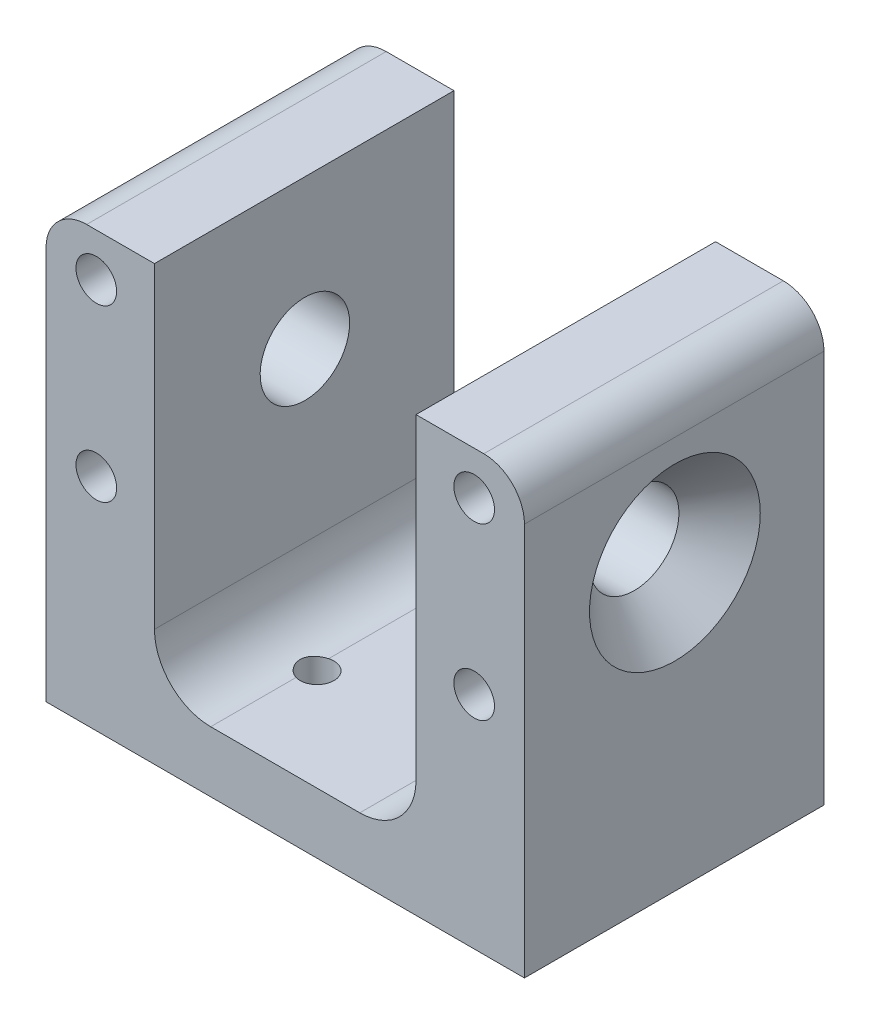
ISO-10303-21;
HEADER;
FILE_DESCRIPTION(('STEP AP214'),'2;1');
FILE_NAME('part.step','',(''),(''),'','','');
FILE_SCHEMA(('AUTOMOTIVE_DESIGN { 1 0 10303 214 1 1 1 1 }'));
ENDSEC;
DATA;
#1=APPLICATION_CONTEXT('core data for automotive mechanical design processes');
#2=APPLICATION_PROTOCOL_DEFINITION('international standard','automotive_design',2000,#1);
#3=PRODUCT_CONTEXT('',#1,'mechanical');
#4=PRODUCT('Part','Part','',(#3));
#5=PRODUCT_RELATED_PRODUCT_CATEGORY('part','',(#4));
#6=PRODUCT_DEFINITION_FORMATION('','',#4);
#7=PRODUCT_DEFINITION_CONTEXT('part definition',#1,'design');
#8=PRODUCT_DEFINITION('design','',#6,#7);
#9=PRODUCT_DEFINITION_SHAPE('','',#8);
#10=(LENGTH_UNIT() NAMED_UNIT(*) SI_UNIT(.MILLI.,.METRE.));
#11=(NAMED_UNIT(*) PLANE_ANGLE_UNIT() SI_UNIT($,.RADIAN.));
#12=(NAMED_UNIT(*) SI_UNIT($,.STERADIAN.) SOLID_ANGLE_UNIT());
#13=UNCERTAINTY_MEASURE_WITH_UNIT(LENGTH_MEASURE(1.E-05),#10,'distance_accuracy_value','');
#14=(GEOMETRIC_REPRESENTATION_CONTEXT(3) GLOBAL_UNCERTAINTY_ASSIGNED_CONTEXT((#13)) GLOBAL_UNIT_ASSIGNED_CONTEXT((#10,
#11,#12)) REPRESENTATION_CONTEXT('',''));
#15=CARTESIAN_POINT('',(0.,0.,0.));
#16=DIRECTION('',(0.,0.,1.));
#17=DIRECTION('',(1.,0.,0.));
#18=AXIS2_PLACEMENT_3D('',#15,#16,#17);
#19=CARTESIAN_POINT('',(27.3,32.,-32.));
#20=DIRECTION('',(1.,0.,0.));
#21=DIRECTION('',(0.,0.,-1.));
#22=AXIS2_PLACEMENT_3D('',#19,#20,#21);
#23=PLANE('',#22);
#24=CARTESIAN_POINT('',(27.3,21.,-11.1));
#25=DIRECTION('',(1.,0.,0.));
#26=DIRECTION('',(0.,0.,-1.));
#27=AXIS2_PLACEMENT_3D('',#24,#25,#26);
#28=CIRCLE('',#27,3.29999999999999);
#29=CARTESIAN_POINT('',(27.3,21.,-14.4));
#30=VERTEX_POINT('',#29);
#31=EDGE_CURVE('E238',#30,#30,#28,.T.);
#32=ORIENTED_EDGE('',*,*,#31,.T.);
#33=EDGE_LOOP('',(#32));
#34=FACE_BOUND('',#33,.T.);
#35=DIRECTION('',(0.,0.,1.));
#36=VECTOR('',#35,1.);
#37=CARTESIAN_POINT('',(27.3,8.63,-22.1));
#38=LINE('',#37,#36);
#39=CARTESIAN_POINT('',(27.3,8.63,-22.1));
#40=VERTEX_POINT('',#39);
#41=CARTESIAN_POINT('',(27.3,8.63,0.));
#42=VERTEX_POINT('',#41);
#43=EDGE_CURVE('E359',#40,#42,#38,.T.);
#44=ORIENTED_EDGE('',*,*,#43,.T.);
#45=DIRECTION('',(0.,1.,0.));
#46=VECTOR('',#45,1.);
#47=CARTESIAN_POINT('',(27.3,32.,0.));
#48=LINE('',#47,#46);
#49=CARTESIAN_POINT('',(27.3,32.,0.));
#50=VERTEX_POINT('',#49);
#51=EDGE_CURVE('E177',#42,#50,#48,.T.);
#52=ORIENTED_EDGE('',*,*,#51,.T.);
#53=DIRECTION('',(0.,0.,1.));
#54=VECTOR('',#53,1.);
#55=CARTESIAN_POINT('',(27.3,32.,0.));
#56=LINE('',#55,#54);
#57=CARTESIAN_POINT('',(27.3,32.,-22.1));
#58=VERTEX_POINT('',#57);
#59=EDGE_CURVE('E211',#58,#50,#56,.T.);
#60=ORIENTED_EDGE('',*,*,#59,.F.);
#61=DIRECTION('',(0.,1.,0.));
#62=VECTOR('',#61,1.);
#63=CARTESIAN_POINT('',(27.3,32.,-22.1));
#64=LINE('',#63,#62);
#65=EDGE_CURVE('E179',#40,#58,#64,.T.);
#66=ORIENTED_EDGE('',*,*,#65,.F.);
#67=EDGE_LOOP('',(#44,#52,#60,#66));
#68=FACE_BOUND('',#67,.T.);
#69=ADVANCED_FACE('F33',(#34,#68),#23,.F.);
#70=CARTESIAN_POINT('',(8.00000000000001,4.48,-32.));
#71=DIRECTION('',(0.,-1.,0.));
#72=DIRECTION('',(1.,0.,0.));
#73=AXIS2_PLACEMENT_3D('',#70,#71,#72);
#74=PLANE('',#73);
#75=DIRECTION('',(0.,0.,1.));
#76=VECTOR('',#75,1.);
#77=CARTESIAN_POINT('',(12.15,4.48,-22.1));
#78=LINE('',#77,#76);
#79=CARTESIAN_POINT('',(12.15,4.48,-22.1));
#80=VERTEX_POINT('',#79);
#81=CARTESIAN_POINT('',(12.15,4.48,-8.7));
#82=VERTEX_POINT('',#81);
#83=EDGE_CURVE('E157',#80,#82,#78,.T.);
#84=ORIENTED_EDGE('',*,*,#83,.T.);
#85=CARTESIAN_POINT('',(12.5,4.48,-7.5));
#86=DIRECTION('',(0.,-1.,0.));
#87=DIRECTION('',(1.,0.,0.));
#88=AXIS2_PLACEMENT_3D('',#85,#86,#87);
#89=CIRCLE('',#88,1.25);
#90=CARTESIAN_POINT('',(12.15,4.48,-6.3));
#91=VERTEX_POINT('',#90);
#92=EDGE_CURVE('E51',#82,#91,#89,.T.);
#93=ORIENTED_EDGE('',*,*,#92,.T.);
#94=CARTESIAN_POINT('',(12.15,4.48,0.));
#95=VERTEX_POINT('',#94);
#96=EDGE_CURVE('E155',#91,#95,#78,.T.);
#97=ORIENTED_EDGE('',*,*,#96,.T.);
#98=DIRECTION('',(1.,0.,0.));
#99=VECTOR('',#98,1.);
#100=CARTESIAN_POINT('',(8.00000000000001,4.48,0.));
#101=LINE('',#100,#99);
#102=CARTESIAN_POINT('',(23.15,4.48,0.));
#103=VERTEX_POINT('',#102);
#104=EDGE_CURVE('E175',#95,#103,#101,.T.);
#105=ORIENTED_EDGE('',*,*,#104,.T.);
#106=DIRECTION('',(0.,0.,1.));
#107=VECTOR('',#106,1.);
#108=CARTESIAN_POINT('',(23.15,4.48,-22.1));
#109=LINE('',#108,#107);
#110=CARTESIAN_POINT('',(23.15,4.48,-6.3));
#111=VERTEX_POINT('',#110);
#112=EDGE_CURVE('E374',#111,#103,#109,.T.);
#113=ORIENTED_EDGE('',*,*,#112,.F.);
#114=CARTESIAN_POINT('',(22.8,4.48,-7.5));
#115=DIRECTION('',(0.,-1.,0.));
#116=DIRECTION('',(1.,0.,0.));
#117=AXIS2_PLACEMENT_3D('',#114,#115,#116);
#118=CIRCLE('',#117,1.25);
#119=CARTESIAN_POINT('',(23.15,4.48,-8.7));
#120=VERTEX_POINT('',#119);
#121=EDGE_CURVE('E58',#111,#120,#118,.T.);
#122=ORIENTED_EDGE('',*,*,#121,.T.);
#123=CARTESIAN_POINT('',(23.15,4.48,-22.1));
#124=VERTEX_POINT('',#123);
#125=EDGE_CURVE('E371',#124,#120,#109,.T.);
#126=ORIENTED_EDGE('',*,*,#125,.F.);
#127=DIRECTION('',(1.,0.,0.));
#128=VECTOR('',#127,1.);
#129=CARTESIAN_POINT('',(0.,4.48,-22.1));
#130=LINE('',#129,#128);
#131=EDGE_CURVE('E217',#80,#124,#130,.T.);
#132=ORIENTED_EDGE('',*,*,#131,.F.);
#133=EDGE_LOOP('',(#84,#93,#97,#105,#113,#122,#126,#132));
#134=FACE_BOUND('',#133,.T.);
#135=ADVANCED_FACE('F153',(#134),#74,.F.);
#136=CARTESIAN_POINT('',(0.,32.,0.));
#137=DIRECTION('',(0.,-1.,0.));
#138=DIRECTION('',(0.,0.,-1.));
#139=AXIS2_PLACEMENT_3D('',#136,#137,#138);
#140=PLANE('',#139);
#141=DIRECTION('',(-1.,0.,0.));
#142=VECTOR('',#141,1.);
#143=CARTESIAN_POINT('',(0.,32.,-22.1));
#144=LINE('',#143,#142);
#145=CARTESIAN_POINT('',(8.,32.,-22.1));
#146=VERTEX_POINT('',#145);
#147=CARTESIAN_POINT('',(3.,32.,-22.1));
#148=VERTEX_POINT('',#147);
#149=EDGE_CURVE('E188',#146,#148,#144,.T.);
#150=ORIENTED_EDGE('',*,*,#149,.T.);
#151=DIRECTION('',(0.,0.,1.));
#152=VECTOR('',#151,1.);
#153=CARTESIAN_POINT('',(3.,32.,0.));
#154=LINE('',#153,#152);
#155=CARTESIAN_POINT('',(3.,32.,0.));
#156=VERTEX_POINT('',#155);
#157=EDGE_CURVE('E233',#148,#156,#154,.T.);
#158=ORIENTED_EDGE('',*,*,#157,.T.);
#159=DIRECTION('',(1.,0.,0.));
#160=VECTOR('',#159,1.);
#161=CARTESIAN_POINT('',(0.,32.,0.));
#162=LINE('',#161,#160);
#163=CARTESIAN_POINT('',(8.,32.,0.));
#164=VERTEX_POINT('',#163);
#165=EDGE_CURVE('E186',#156,#164,#162,.T.);
#166=ORIENTED_EDGE('',*,*,#165,.T.);
#167=DIRECTION('',(0.,0.,-1.));
#168=VECTOR('',#167,1.);
#169=CARTESIAN_POINT('',(8.,32.,0.));
#170=LINE('',#169,#168);
#171=EDGE_CURVE('E214',#164,#146,#170,.T.);
#172=ORIENTED_EDGE('',*,*,#171,.T.);
#173=EDGE_LOOP('',(#150,#158,#166,#172));
#174=FACE_BOUND('',#173,.T.);
#175=ADVANCED_FACE('F307',(#174),#140,.F.);
#176=CARTESIAN_POINT('',(0.,32.,0.));
#177=DIRECTION('',(1.,0.,0.));
#178=DIRECTION('',(0.,0.,-1.));
#179=AXIS2_PLACEMENT_3D('',#176,#177,#178);
#180=PLANE('',#179);
#181=CARTESIAN_POINT('',(0.,21.,-11.1));
#182=DIRECTION('',(1.,0.,0.));
#183=DIRECTION('',(0.,0.,-1.));
#184=AXIS2_PLACEMENT_3D('',#181,#182,#183);
#185=CIRCLE('',#184,3.29999999999999);
#186=CARTESIAN_POINT('',(0.,21.,-14.4));
#187=VERTEX_POINT('',#186);
#188=EDGE_CURVE('E364',#187,#187,#185,.T.);
#189=ORIENTED_EDGE('',*,*,#188,.T.);
#190=EDGE_LOOP('',(#189));
#191=FACE_BOUND('',#190,.T.);
#192=DIRECTION('',(0.,-1.,0.));
#193=VECTOR('',#192,1.);
#194=CARTESIAN_POINT('',(0.,32.,0.));
#195=LINE('',#194,#193);
#196=CARTESIAN_POINT('',(0.,29.,0.));
#197=VERTEX_POINT('',#196);
#198=CARTESIAN_POINT('',(0.,0.,0.));
#199=VERTEX_POINT('',#198);
#200=EDGE_CURVE('E209',#197,#199,#195,.T.);
#201=ORIENTED_EDGE('',*,*,#200,.F.);
#202=DIRECTION('',(0.,0.,1.));
#203=VECTOR('',#202,1.);
#204=CARTESIAN_POINT('',(0.,29.,0.));
#205=LINE('',#204,#203);
#206=CARTESIAN_POINT('',(0.,29.,-22.1));
#207=VERTEX_POINT('',#206);
#208=EDGE_CURVE('E236',#197,#207,#205,.F.);
#209=ORIENTED_EDGE('',*,*,#208,.T.);
#210=DIRECTION('',(0.,-1.,0.));
#211=VECTOR('',#210,1.);
#212=CARTESIAN_POINT('',(0.,32.,-22.1));
#213=LINE('',#212,#211);
#214=CARTESIAN_POINT('',(0.,0.,-22.1));
#215=VERTEX_POINT('',#214);
#216=EDGE_CURVE('E192',#207,#215,#213,.T.);
#217=ORIENTED_EDGE('',*,*,#216,.T.);
#218=DIRECTION('',(0.,0.,1.));
#219=VECTOR('',#218,1.);
#220=CARTESIAN_POINT('',(0.,0.,0.));
#221=LINE('',#220,#219);
#222=EDGE_CURVE('E185',#215,#199,#221,.T.);
#223=ORIENTED_EDGE('',*,*,#222,.T.);
#224=EDGE_LOOP('',(#201,#209,#217,#223));
#225=FACE_BOUND('',#224,.T.);
#226=ADVANCED_FACE('F335',(#191,#225),#180,.F.);
#227=CARTESIAN_POINT('',(0.,32.,0.));
#228=DIRECTION('',(0.,0.,-1.));
#229=DIRECTION('',(-1.,0.,0.));
#230=AXIS2_PLACEMENT_3D('',#227,#228,#229);
#231=PLANE('',#230);
#232=CARTESIAN_POINT('',(3.71,28.82,0.));
#233=DIRECTION('',(0.,0.,1.));
#234=DIRECTION('',(1.,0.,0.));
#235=AXIS2_PLACEMENT_3D('',#232,#233,#234);
#236=CIRCLE('',#235,1.5);
#237=CARTESIAN_POINT('',(5.21,28.82,0.));
#238=VERTEX_POINT('',#237);
#239=EDGE_CURVE('E399',#238,#238,#236,.T.);
#240=ORIENTED_EDGE('',*,*,#239,.F.);
#241=EDGE_LOOP('',(#240));
#242=FACE_BOUND('',#241,.T.);
#243=CARTESIAN_POINT('',(3.71,16.26,0.));
#244=DIRECTION('',(0.,0.,1.));
#245=DIRECTION('',(1.,0.,0.));
#246=AXIS2_PLACEMENT_3D('',#243,#244,#245);
#247=CIRCLE('',#246,1.5);
#248=CARTESIAN_POINT('',(5.21,16.26,0.));
#249=VERTEX_POINT('',#248);
#250=EDGE_CURVE('E409',#249,#249,#247,.T.);
#251=ORIENTED_EDGE('',*,*,#250,.F.);
#252=EDGE_LOOP('',(#251));
#253=FACE_BOUND('',#252,.T.);
#254=CARTESIAN_POINT('',(31.59,28.82,0.));
#255=DIRECTION('',(0.,0.,1.));
#256=DIRECTION('',(1.,0.,0.));
#257=AXIS2_PLACEMENT_3D('',#254,#255,#256);
#258=CIRCLE('',#257,1.5);
#259=CARTESIAN_POINT('',(33.09,28.82,0.));
#260=VERTEX_POINT('',#259);
#261=EDGE_CURVE('E415',#260,#260,#258,.T.);
#262=ORIENTED_EDGE('',*,*,#261,.F.);
#263=EDGE_LOOP('',(#262));
#264=FACE_BOUND('',#263,.T.);
#265=CARTESIAN_POINT('',(31.59,16.26,0.));
#266=DIRECTION('',(0.,0.,1.));
#267=DIRECTION('',(1.,0.,0.));
#268=AXIS2_PLACEMENT_3D('',#265,#266,#267);
#269=CIRCLE('',#268,1.5);
#270=CARTESIAN_POINT('',(33.09,16.26,0.));
#271=VERTEX_POINT('',#270);
#272=EDGE_CURVE('E421',#271,#271,#269,.T.);
#273=ORIENTED_EDGE('',*,*,#272,.F.);
#274=EDGE_LOOP('',(#273));
#275=FACE_BOUND('',#274,.T.);
#276=DIRECTION('',(0.,-1.,0.));
#277=VECTOR('',#276,1.);
#278=CARTESIAN_POINT('',(35.3,32.,0.));
#279=LINE('',#278,#277);
#280=CARTESIAN_POINT('',(35.3,29.,0.));
#281=VERTEX_POINT('',#280);
#282=CARTESIAN_POINT('',(35.3,0.,0.));
#283=VERTEX_POINT('',#282);
#284=EDGE_CURVE('E207',#281,#283,#279,.T.);
#285=ORIENTED_EDGE('',*,*,#284,.F.);
#286=CARTESIAN_POINT('',(32.3,29.,0.));
#287=DIRECTION('',(0.,0.,-1.));
#288=DIRECTION('',(-1.,0.,0.));
#289=AXIS2_PLACEMENT_3D('',#286,#287,#288);
#290=CIRCLE('',#289,3.);
#291=CARTESIAN_POINT('',(32.3,32.,0.));
#292=VERTEX_POINT('',#291);
#293=EDGE_CURVE('E231',#281,#292,#290,.F.);
#294=ORIENTED_EDGE('',*,*,#293,.T.);
#295=EDGE_CURVE('E189',#50,#292,#162,.T.);
#296=ORIENTED_EDGE('',*,*,#295,.F.);
#297=ORIENTED_EDGE('',*,*,#51,.F.);
#298=CARTESIAN_POINT('',(23.15,8.63,0.));
#299=DIRECTION('',(0.,0.,-1.));
#300=DIRECTION('',(1.,0.,0.));
#301=AXIS2_PLACEMENT_3D('',#298,#299,#300);
#302=CIRCLE('',#301,4.15);
#303=EDGE_CURVE('E362',#42,#103,#302,.T.);
#304=ORIENTED_EDGE('',*,*,#303,.T.);
#305=ORIENTED_EDGE('',*,*,#104,.F.);
#306=CARTESIAN_POINT('',(12.15,8.63,0.));
#307=DIRECTION('',(0.,0.,-1.));
#308=DIRECTION('',(1.,0.,0.));
#309=AXIS2_PLACEMENT_3D('',#306,#307,#308);
#310=CIRCLE('',#309,4.15);
#311=CARTESIAN_POINT('',(8.00000000000001,8.63000000000001,0.));
#312=VERTEX_POINT('',#311);
#313=EDGE_CURVE('E165',#95,#312,#310,.T.);
#314=ORIENTED_EDGE('',*,*,#313,.T.);
#315=DIRECTION('',(0.,-1.,0.));
#316=VECTOR('',#315,1.);
#317=CARTESIAN_POINT('',(8.,32.,0.));
#318=LINE('',#317,#316);
#319=EDGE_CURVE('E168',#164,#312,#318,.T.);
#320=ORIENTED_EDGE('',*,*,#319,.F.);
#321=ORIENTED_EDGE('',*,*,#165,.F.);
#322=CARTESIAN_POINT('',(3.,29.,0.));
#323=DIRECTION('',(0.,0.,-1.));
#324=DIRECTION('',(-1.,0.,0.));
#325=AXIS2_PLACEMENT_3D('',#322,#323,#324);
#326=CIRCLE('',#325,3.);
#327=EDGE_CURVE('E229',#156,#197,#326,.F.);
#328=ORIENTED_EDGE('',*,*,#327,.T.);
#329=ORIENTED_EDGE('',*,*,#200,.T.);
#330=DIRECTION('',(1.,0.,0.));
#331=VECTOR('',#330,1.);
#332=CARTESIAN_POINT('',(0.,0.,0.));
#333=LINE('',#332,#331);
#334=EDGE_CURVE('E195',#199,#283,#333,.T.);
#335=ORIENTED_EDGE('',*,*,#334,.T.);
#336=EDGE_LOOP('',(#285,#294,#296,#297,#304,#305,#314,#320,#321,#328,#329,#335));
#337=FACE_BOUND('',#336,.T.);
#338=ADVANCED_FACE('F331',(#242,#253,#264,#275,#337),#231,.F.);
#339=CARTESIAN_POINT('',(35.3,32.,0.));
#340=DIRECTION('',(-1.,0.,0.));
#341=DIRECTION('',(0.,0.,1.));
#342=AXIS2_PLACEMENT_3D('',#339,#340,#341);
#343=PLANE('',#342);
#344=CARTESIAN_POINT('',(35.3,21.,-11.1));
#345=DIRECTION('',(1.,0.,0.));
#346=DIRECTION('',(0.,0.,-1.));
#347=AXIS2_PLACEMENT_3D('',#344,#345,#346);
#348=CIRCLE('',#347,6.3);
#349=CARTESIAN_POINT('',(35.3,21.,-17.4));
#350=VERTEX_POINT('',#349);
#351=EDGE_CURVE('E427',#350,#350,#348,.T.);
#352=ORIENTED_EDGE('',*,*,#351,.F.);
#353=EDGE_LOOP('',(#352));
#354=FACE_BOUND('',#353,.T.);
#355=DIRECTION('',(0.,-1.,0.));
#356=VECTOR('',#355,1.);
#357=CARTESIAN_POINT('',(35.3,32.,-22.1));
#358=LINE('',#357,#356);
#359=CARTESIAN_POINT('',(35.3,29.,-22.1));
#360=VERTEX_POINT('',#359);
#361=CARTESIAN_POINT('',(35.3,0.,-22.1));
#362=VERTEX_POINT('',#361);
#363=EDGE_CURVE('E205',#360,#362,#358,.T.);
#364=ORIENTED_EDGE('',*,*,#363,.F.);
#365=DIRECTION('',(0.,0.,-1.));
#366=VECTOR('',#365,1.);
#367=CARTESIAN_POINT('',(35.3,29.,0.));
#368=LINE('',#367,#366);
#369=EDGE_CURVE('E227',#360,#281,#368,.F.);
#370=ORIENTED_EDGE('',*,*,#369,.T.);
#371=ORIENTED_EDGE('',*,*,#284,.T.);
#372=DIRECTION('',(0.,0.,-1.));
#373=VECTOR('',#372,1.);
#374=CARTESIAN_POINT('',(35.3,0.,0.));
#375=LINE('',#374,#373);
#376=EDGE_CURVE('E198',#283,#362,#375,.T.);
#377=ORIENTED_EDGE('',*,*,#376,.T.);
#378=EDGE_LOOP('',(#364,#370,#371,#377));
#379=FACE_BOUND('',#378,.T.);
#380=ADVANCED_FACE('F327',(#354,#379),#343,.F.);
#381=CARTESIAN_POINT('',(0.,32.,-22.1));
#382=DIRECTION('',(0.,0.,1.));
#383=DIRECTION('',(1.,0.,0.));
#384=AXIS2_PLACEMENT_3D('',#381,#382,#383);
#385=PLANE('',#384);
#386=CARTESIAN_POINT('',(32.3,32.,-22.1));
#387=VERTEX_POINT('',#386);
#388=EDGE_CURVE('E190',#387,#58,#144,.T.);
#389=ORIENTED_EDGE('',*,*,#388,.F.);
#390=CARTESIAN_POINT('',(32.3,29.,-22.1));
#391=DIRECTION('',(0.,0.,1.));
#392=DIRECTION('',(1.,0.,0.));
#393=AXIS2_PLACEMENT_3D('',#390,#391,#392);
#394=CIRCLE('',#393,3.);
#395=EDGE_CURVE('E225',#387,#360,#394,.F.);
#396=ORIENTED_EDGE('',*,*,#395,.T.);
#397=ORIENTED_EDGE('',*,*,#363,.T.);
#398=DIRECTION('',(-1.,0.,0.));
#399=VECTOR('',#398,1.);
#400=CARTESIAN_POINT('',(0.,0.,-22.1));
#401=LINE('',#400,#399);
#402=EDGE_CURVE('E201',#362,#215,#401,.T.);
#403=ORIENTED_EDGE('',*,*,#402,.T.);
#404=ORIENTED_EDGE('',*,*,#216,.F.);
#405=CARTESIAN_POINT('',(3.,29.,-22.1));
#406=DIRECTION('',(0.,0.,1.));
#407=DIRECTION('',(1.,0.,0.));
#408=AXIS2_PLACEMENT_3D('',#405,#406,#407);
#409=CIRCLE('',#408,3.);
#410=EDGE_CURVE('E223',#207,#148,#409,.F.);
#411=ORIENTED_EDGE('',*,*,#410,.T.);
#412=ORIENTED_EDGE('',*,*,#149,.F.);
#413=DIRECTION('',(0.,-1.,0.));
#414=VECTOR('',#413,1.);
#415=CARTESIAN_POINT('',(8.,32.,-22.1));
#416=LINE('',#415,#414);
#417=CARTESIAN_POINT('',(8.00000000000001,8.63,-22.1));
#418=VERTEX_POINT('',#417);
#419=EDGE_CURVE('E182',#146,#418,#416,.T.);
#420=ORIENTED_EDGE('',*,*,#419,.T.);
#421=CARTESIAN_POINT('',(12.15,8.63,-22.1));
#422=DIRECTION('',(0.,0.,-1.));
#423=DIRECTION('',(1.,0.,0.));
#424=AXIS2_PLACEMENT_3D('',#421,#422,#423);
#425=CIRCLE('',#424,4.15);
#426=EDGE_CURVE('E169',#80,#418,#425,.T.);
#427=ORIENTED_EDGE('',*,*,#426,.F.);
#428=ORIENTED_EDGE('',*,*,#131,.T.);
#429=CARTESIAN_POINT('',(23.15,8.63,-22.1));
#430=DIRECTION('',(0.,0.,-1.));
#431=DIRECTION('',(1.,0.,0.));
#432=AXIS2_PLACEMENT_3D('',#429,#430,#431);
#433=CIRCLE('',#432,4.15);
#434=EDGE_CURVE('E363',#40,#124,#433,.T.);
#435=ORIENTED_EDGE('',*,*,#434,.F.);
#436=ORIENTED_EDGE('',*,*,#65,.T.);
#437=EDGE_LOOP('',(#389,#396,#397,#403,#404,#411,#412,#420,#427,#428,#435,#436));
#438=FACE_BOUND('',#437,.T.);
#439=ADVANCED_FACE('F320',(#438),#385,.F.);
#440=ORIENTED_EDGE('',*,*,#295,.T.);
#441=DIRECTION('',(0.,0.,-1.));
#442=VECTOR('',#441,1.);
#443=CARTESIAN_POINT('',(32.3,32.,0.));
#444=LINE('',#443,#442);
#445=EDGE_CURVE('E220',#292,#387,#444,.T.);
#446=ORIENTED_EDGE('',*,*,#445,.T.);
#447=ORIENTED_EDGE('',*,*,#388,.T.);
#448=ORIENTED_EDGE('',*,*,#59,.T.);
#449=EDGE_LOOP('',(#440,#446,#447,#448));
#450=FACE_BOUND('',#449,.T.);
#451=ADVANCED_FACE('F317',(#450),#140,.F.);
#452=CARTESIAN_POINT('',(0.,0.,0.));
#453=DIRECTION('',(0.,-1.,0.));
#454=DIRECTION('',(0.,0.,-1.));
#455=AXIS2_PLACEMENT_3D('',#452,#453,#454);
#456=PLANE('',#455);
#457=CARTESIAN_POINT('',(12.5,0.,-7.5));
#458=DIRECTION('',(0.,-1.,0.));
#459=DIRECTION('',(0.,0.,-1.));
#460=AXIS2_PLACEMENT_3D('',#457,#458,#459);
#461=CIRCLE('',#460,1.25);
#462=CARTESIAN_POINT('',(12.5,0.,-8.75));
#463=VERTEX_POINT('',#462);
#464=EDGE_CURVE('E159',#463,#463,#461,.T.);
#465=ORIENTED_EDGE('',*,*,#464,.F.);
#466=EDGE_LOOP('',(#465));
#467=FACE_BOUND('',#466,.T.);
#468=CARTESIAN_POINT('',(22.8,0.,-7.5));
#469=DIRECTION('',(0.,-1.,0.));
#470=DIRECTION('',(0.,0.,-1.));
#471=AXIS2_PLACEMENT_3D('',#468,#469,#470);
#472=CIRCLE('',#471,1.25);
#473=CARTESIAN_POINT('',(22.8,0.,-8.75));
#474=VERTEX_POINT('',#473);
#475=EDGE_CURVE('E158',#474,#474,#472,.T.);
#476=ORIENTED_EDGE('',*,*,#475,.F.);
#477=EDGE_LOOP('',(#476));
#478=FACE_BOUND('',#477,.T.);
#479=ORIENTED_EDGE('',*,*,#222,.F.);
#480=ORIENTED_EDGE('',*,*,#402,.F.);
#481=ORIENTED_EDGE('',*,*,#376,.F.);
#482=ORIENTED_EDGE('',*,*,#334,.F.);
#483=EDGE_LOOP('',(#479,#480,#481,#482));
#484=FACE_BOUND('',#483,.T.);
#485=ADVANCED_FACE('F315',(#467,#478,#484),#456,.T.);
#486=CARTESIAN_POINT('',(8.,32.,-32.));
#487=DIRECTION('',(-1.,0.,0.));
#488=DIRECTION('',(0.,-1.,0.));
#489=AXIS2_PLACEMENT_3D('',#486,#487,#488);
#490=PLANE('',#489);
#491=CARTESIAN_POINT('',(8.,21.,-11.1));
#492=DIRECTION('',(-1.,0.,0.));
#493=DIRECTION('',(0.,-1.,0.));
#494=AXIS2_PLACEMENT_3D('',#491,#492,#493);
#495=CIRCLE('',#494,3.29999999999999);
#496=CARTESIAN_POINT('',(8.00000000000001,17.7,-11.1));
#497=VERTEX_POINT('',#496);
#498=EDGE_CURVE('E240',#497,#497,#495,.T.);
#499=ORIENTED_EDGE('',*,*,#498,.T.);
#500=EDGE_LOOP('',(#499));
#501=FACE_BOUND('',#500,.T.);
#502=ORIENTED_EDGE('',*,*,#319,.T.);
#503=DIRECTION('',(0.,0.,1.));
#504=VECTOR('',#503,1.);
#505=CARTESIAN_POINT('',(8.,8.63,-22.1));
#506=LINE('',#505,#504);
#507=EDGE_CURVE('E166',#418,#312,#506,.T.);
#508=ORIENTED_EDGE('',*,*,#507,.F.);
#509=ORIENTED_EDGE('',*,*,#419,.F.);
#510=ORIENTED_EDGE('',*,*,#171,.F.);
#511=EDGE_LOOP('',(#502,#508,#509,#510));
#512=FACE_BOUND('',#511,.T.);
#513=ADVANCED_FACE('F312',(#501,#512),#490,.F.);
#514=CARTESIAN_POINT('',(12.15,8.63,-22.1));
#515=DIRECTION('',(0.,0.,1.));
#516=DIRECTION('',(1.,0.,0.));
#517=AXIS2_PLACEMENT_3D('',#514,#515,#516);
#518=CYLINDRICAL_SURFACE('',#517,4.15);
#519=CARTESIAN_POINT('',(12.15,4.48,-8.7));
#520=CARTESIAN_POINT('',(12.1166404241808,4.47999801006615,-8.69027060575951));
#521=CARTESIAN_POINT('',(12.0837047680773,4.48040259929234,-8.67915358301768));
#522=CARTESIAN_POINT('',(12.018894119517,4.48194515428987,-8.6542283495317));
#523=CARTESIAN_POINT('',(11.9870188857936,4.48308295202527,-8.64042075591528));
#524=CARTESIAN_POINT('',(11.8934471758358,4.4874690189818,-8.59516125886698));
#525=CARTESIAN_POINT('',(11.8336242945491,4.49169081183113,-8.5598197524674));
#526=CARTESIAN_POINT('',(11.7207929620676,4.50186458573516,-8.47985927314622));
#527=CARTESIAN_POINT('',(11.667782438967,4.50781603892757,-8.43524313186314));
#528=CARTESIAN_POINT('',(11.5698655600581,4.52045217128397,-8.33792223659628));
#529=CARTESIAN_POINT('',(11.5249613140545,4.52713704060696,-8.28521538344462));
#530=CARTESIAN_POINT('',(11.4436702943323,4.54033837676653,-8.17202316939695));
#531=CARTESIAN_POINT('',(11.4074623695279,4.54684919736478,-8.11140858890091));
#532=CARTESIAN_POINT('',(11.3457121052872,4.55856124859131,-7.98484642679041));
#533=CARTESIAN_POINT('',(11.3201697026365,4.5637624869814,-7.91889887678719));
#534=CARTESIAN_POINT('',(11.2806094205883,4.57203611304779,-7.78376694705087));
#535=CARTESIAN_POINT('',(11.2665488281547,4.57511638408186,-7.71459558517367));
#536=CARTESIAN_POINT('',(11.250259401816,4.57869911668306,-7.57481525411824));
#537=CARTESIAN_POINT('',(11.2480282310809,4.57920208737945,-7.50420657164064));
#538=CARTESIAN_POINT('',(11.2553864402146,4.57757131690484,-7.3651645009829));
#539=CARTESIAN_POINT('',(11.264723580432,4.57549383830929,-7.29671691928874));
#540=CARTESIAN_POINT('',(11.2944914972905,4.56910919856421,-7.16238663655303));
#541=CARTESIAN_POINT('',(11.3149231554137,4.56480186024904,-7.09650413975851));
#542=CARTESIAN_POINT('',(11.3663654343981,4.55457326524355,-6.9688421917132));
#543=CARTESIAN_POINT('',(11.397417978527,4.54864563175673,-6.90708017757159));
#544=CARTESIAN_POINT('',(11.4692225600537,4.53605739183428,-6.78954826804278));
#545=CARTESIAN_POINT('',(11.5099767560919,4.52939662245175,-6.73377971022782));
#546=CARTESIAN_POINT('',(11.6011162713627,4.51619523950543,-6.62852898356884));
#547=CARTESIAN_POINT('',(11.6516949178327,4.50966055493349,-6.57921341147551));
#548=CARTESIAN_POINT('',(11.760508924954,4.49795688017279,-6.48974972383785));
#549=CARTESIAN_POINT('',(11.8187386452765,4.49278689230388,-6.44959491412454));
#550=CARTESIAN_POINT('',(11.9224932220481,4.48602174612197,-6.39032084731549));
#551=CARTESIAN_POINT('',(11.9664700797425,4.48381708961996,-6.36852208438633));
#552=CARTESIAN_POINT('',(12.056684264607,4.4808012750692,-6.33022335387813));
#553=CARTESIAN_POINT('',(12.1029201434935,4.47998923594812,-6.31372004138443));
#554=CARTESIAN_POINT('',(12.15,4.48,-6.3));
#555=B_SPLINE_CURVE_WITH_KNOTS('',3,(#519,#520,#521,#522,#523,#524,#525,#526,#527,#528,#529,
#530,#531,#532,#533,#534,#535,#536,#537,#538,#539,#540,#541,#542,#543,#544,#545,#546,#547,#548,
#549,#550,#551,#552,#553,#554),.UNSPECIFIED.,.F.,.F.,(4,2,2,2,2,2,2,2,2,2,2,2,2,2,2,2,2,4),(0.,
0.104180121329862,0.208336375261838,0.416092306865267,0.623784901427285,0.831531474037408,
1.04324161395688,1.25495049905337,1.46586817954205,1.67674419298103,1.88310203441118,
2.08947627379224,2.29667470881923,2.50391928915042,2.71575414584635,2.92743370616347,
3.07449386436807,3.2214609471145),.UNSPECIFIED.);
#556=EDGE_CURVE('E11',#82,#91,#555,.T.);
#557=ORIENTED_EDGE('',*,*,#556,.F.);
#558=ORIENTED_EDGE('',*,*,#83,.F.);
#559=ORIENTED_EDGE('',*,*,#426,.T.);
#560=ORIENTED_EDGE('',*,*,#507,.T.);
#561=ORIENTED_EDGE('',*,*,#313,.F.);
#562=ORIENTED_EDGE('',*,*,#96,.F.);
#563=EDGE_LOOP('',(#557,#558,#559,#560,#561,#562));
#564=FACE_BOUND('',#563,.T.);
#565=ADVANCED_FACE('F162',(#564),#518,.F.);
#566=CARTESIAN_POINT('',(23.15,8.63,-22.1));
#567=DIRECTION('',(0.,0.,1.));
#568=DIRECTION('',(1.,0.,0.));
#569=AXIS2_PLACEMENT_3D('',#566,#567,#568);
#570=CYLINDRICAL_SURFACE('',#569,4.15);
#571=CARTESIAN_POINT('',(23.15,4.48,-6.3));
#572=CARTESIAN_POINT('',(23.1833595758192,4.47999801006614,-6.30972939424049));
#573=CARTESIAN_POINT('',(23.2162952319227,4.48040259929234,-6.32084641698232));
#574=CARTESIAN_POINT('',(23.2811058804829,4.48194515428986,-6.3457716504683));
#575=CARTESIAN_POINT('',(23.3129811142064,4.48308295202527,-6.35957924408472));
#576=CARTESIAN_POINT('',(23.4065528241642,4.4874690189818,-6.40483874113302));
#577=CARTESIAN_POINT('',(23.4663757054509,4.49169081183113,-6.4401802475326));
#578=CARTESIAN_POINT('',(23.5792070379324,4.50186458573516,-6.52014072685377));
#579=CARTESIAN_POINT('',(23.632217561033,4.50781603892757,-6.56475686813686));
#580=CARTESIAN_POINT('',(23.7301344399419,4.52045217128397,-6.66207776340372));
#581=CARTESIAN_POINT('',(23.7750386859455,4.52713704060696,-6.71478461655537));
#582=CARTESIAN_POINT('',(23.8563297056677,4.54033837676653,-6.82797683060305));
#583=CARTESIAN_POINT('',(23.8925376304721,4.54684919736478,-6.88859141109908));
#584=CARTESIAN_POINT('',(23.9542878947128,4.55856124859131,-7.01515357320959));
#585=CARTESIAN_POINT('',(23.9798302973635,4.5637624869814,-7.08110112321281));
#586=CARTESIAN_POINT('',(24.0193905794117,4.57203611304779,-7.21623305294913));
#587=CARTESIAN_POINT('',(24.0334511718453,4.57511638408186,-7.28540441482633));
#588=CARTESIAN_POINT('',(24.049740598184,4.57869911668306,-7.42518474588176));
#589=CARTESIAN_POINT('',(24.0519717689191,4.57920208737945,-7.49579342835935));
#590=CARTESIAN_POINT('',(24.0446135597854,4.57757131690484,-7.6348354990171));
#591=CARTESIAN_POINT('',(24.035276419568,4.57549383830929,-7.70328308071126));
#592=CARTESIAN_POINT('',(24.0055085027095,4.56910919856421,-7.83761336344697));
#593=CARTESIAN_POINT('',(23.9850768445863,4.56480186024904,-7.90349586024149));
#594=CARTESIAN_POINT('',(23.9336345656018,4.55457326524355,-8.0311578082868));
#595=CARTESIAN_POINT('',(23.902582021473,4.54864563175673,-8.09291982242841));
#596=CARTESIAN_POINT('',(23.8307774399463,4.53605739183428,-8.21045173195721));
#597=CARTESIAN_POINT('',(23.7900232439081,4.52939662245175,-8.26622028977217));
#598=CARTESIAN_POINT('',(23.6988837286373,4.51619523950543,-8.37147101643115));
#599=CARTESIAN_POINT('',(23.6483050821673,4.50966055493349,-8.42078658852449));
#600=CARTESIAN_POINT('',(23.539491075046,4.49795688017279,-8.51025027616215));
#601=CARTESIAN_POINT('',(23.4812613547235,4.49278689230388,-8.55040508587546));
#602=CARTESIAN_POINT('',(23.3775067779519,4.48602174612197,-8.60967915268451));
#603=CARTESIAN_POINT('',(23.3335299202574,4.48381708961996,-8.63147791561368));
#604=CARTESIAN_POINT('',(23.243315735393,4.4808012750692,-8.66977664612187));
#605=CARTESIAN_POINT('',(23.1970798565065,4.47998923594812,-8.68627995861557));
#606=CARTESIAN_POINT('',(23.15,4.48,-8.7));
#607=B_SPLINE_CURVE_WITH_KNOTS('',3,(#571,#572,#573,#574,#575,#576,#577,#578,#579,#580,#581,
#582,#583,#584,#585,#586,#587,#588,#589,#590,#591,#592,#593,#594,#595,#596,#597,#598,#599,#600,
#601,#602,#603,#604,#605,#606),.UNSPECIFIED.,.F.,.F.,(4,2,2,2,2,2,2,2,2,2,2,2,2,2,2,2,2,4),(0.,
0.104180121329862,0.208336375261835,0.416092306865268,0.623784901427276,0.831531474037408,
1.04324161395688,1.25495049905337,1.46586817954205,1.67674419298103,1.88310203441118,
2.08947627379224,2.29667470881923,2.50391928915042,2.71575414584635,2.92743370616347,
3.07449386436808,3.2214609471145),.UNSPECIFIED.);
#608=EDGE_CURVE('E46',#111,#120,#607,.T.);
#609=ORIENTED_EDGE('',*,*,#608,.F.);
#610=ORIENTED_EDGE('',*,*,#112,.T.);
#611=ORIENTED_EDGE('',*,*,#303,.F.);
#612=ORIENTED_EDGE('',*,*,#43,.F.);
#613=ORIENTED_EDGE('',*,*,#434,.T.);
#614=ORIENTED_EDGE('',*,*,#125,.T.);
#615=EDGE_LOOP('',(#609,#610,#611,#612,#613,#614));
#616=FACE_BOUND('',#615,.T.);
#617=ADVANCED_FACE('F247',(#616),#570,.F.);
#618=CARTESIAN_POINT('',(32.3,29.,0.));
#619=DIRECTION('',(0.,0.,-1.));
#620=DIRECTION('',(-1.,0.,0.));
#621=AXIS2_PLACEMENT_3D('',#618,#619,#620);
#622=CYLINDRICAL_SURFACE('',#621,3.);
#623=ORIENTED_EDGE('',*,*,#293,.F.);
#624=ORIENTED_EDGE('',*,*,#369,.F.);
#625=ORIENTED_EDGE('',*,*,#395,.F.);
#626=ORIENTED_EDGE('',*,*,#445,.F.);
#627=EDGE_LOOP('',(#623,#624,#625,#626));
#628=FACE_BOUND('',#627,.T.);
#629=ADVANCED_FACE('F339',(#628),#622,.T.);
#630=CARTESIAN_POINT('',(3.,29.,0.));
#631=DIRECTION('',(0.,0.,1.));
#632=DIRECTION('',(1.,0.,0.));
#633=AXIS2_PLACEMENT_3D('',#630,#631,#632);
#634=CYLINDRICAL_SURFACE('',#633,3.);
#635=ORIENTED_EDGE('',*,*,#410,.F.);
#636=ORIENTED_EDGE('',*,*,#208,.F.);
#637=ORIENTED_EDGE('',*,*,#327,.F.);
#638=ORIENTED_EDGE('',*,*,#157,.F.);
#639=EDGE_LOOP('',(#635,#636,#637,#638));
#640=FACE_BOUND('',#639,.T.);
#641=ADVANCED_FACE('F35',(#640),#634,.T.);
#642=CARTESIAN_POINT('',(35.3,21.,-11.1));
#643=DIRECTION('',(1.,0.,0.));
#644=DIRECTION('',(0.,0.,-1.));
#645=AXIS2_PLACEMENT_3D('',#642,#643,#644);
#646=CYLINDRICAL_SURFACE('',#645,3.29999999999999);
#647=CARTESIAN_POINT('',(32.3,21.,-11.1));
#648=DIRECTION('',(1.,0.,0.));
#649=DIRECTION('',(0.,0.,-1.));
#650=AXIS2_PLACEMENT_3D('',#647,#648,#649);
#651=CIRCLE('',#650,3.29999999999999);
#652=CARTESIAN_POINT('',(32.3,21.,-14.4));
#653=VERTEX_POINT('',#652);
#654=EDGE_CURVE('E241',#653,#653,#651,.T.);
#655=ORIENTED_EDGE('',*,*,#654,.T.);
#656=EDGE_LOOP('',(#655));
#657=FACE_BOUND('',#656,.T.);
#658=ORIENTED_EDGE('',*,*,#31,.F.);
#659=EDGE_LOOP('',(#658));
#660=FACE_BOUND('',#659,.T.);
#661=ADVANCED_FACE('F291',(#657,#660),#646,.F.);
#662=CARTESIAN_POINT('',(35.3,21.,-11.1));
#663=DIRECTION('',(1.,0.,0.));
#664=DIRECTION('',(0.,0.,-1.));
#665=AXIS2_PLACEMENT_3D('',#662,#663,#664);
#666=CONICAL_SURFACE('',#665,6.3,0.785398163397448);
#667=ORIENTED_EDGE('',*,*,#654,.F.);
#668=EDGE_LOOP('',(#667));
#669=FACE_BOUND('',#668,.T.);
#670=ORIENTED_EDGE('',*,*,#351,.T.);
#671=EDGE_LOOP('',(#670));
#672=FACE_BOUND('',#671,.T.);
#673=ADVANCED_FACE('F289',(#669,#672),#666,.F.);
#674=ORIENTED_EDGE('',*,*,#498,.F.);
#675=EDGE_LOOP('',(#674));
#676=FACE_BOUND('',#675,.T.);
#677=ORIENTED_EDGE('',*,*,#188,.F.);
#678=EDGE_LOOP('',(#677));
#679=FACE_BOUND('',#678,.T.);
#680=ADVANCED_FACE('F287',(#676,#679),#646,.F.);
#681=CARTESIAN_POINT('',(31.59,16.26,-10.));
#682=DIRECTION('',(0.,0.,1.));
#683=DIRECTION('',(1.,0.,0.));
#684=AXIS2_PLACEMENT_3D('',#681,#682,#683);
#685=CONICAL_SURFACE('',#684,1.49999999999999,1.02974425867665);
#686=CARTESIAN_POINT('',(31.59,16.26,-10.9012909285413));
#687=VERTEX_POINT('',#686);
#688=VERTEX_LOOP('',#687);
#689=FACE_BOUND('',#688,.T.);
#690=CARTESIAN_POINT('',(31.59,16.26,-10.));
#691=DIRECTION('',(0.,0.,1.));
#692=DIRECTION('',(1.,0.,0.));
#693=AXIS2_PLACEMENT_3D('',#690,#691,#692);
#694=CIRCLE('',#693,1.49999999999999);
#695=CARTESIAN_POINT('',(33.09,16.26,-10.));
#696=VERTEX_POINT('',#695);
#697=EDGE_CURVE('E424',#696,#696,#694,.T.);
#698=ORIENTED_EDGE('',*,*,#697,.T.);
#699=EDGE_LOOP('',(#698));
#700=FACE_BOUND('',#699,.T.);
#701=ADVANCED_FACE('F283',(#689,#700),#685,.F.);
#702=CARTESIAN_POINT('',(31.59,16.26,0.));
#703=DIRECTION('',(0.,0.,1.));
#704=DIRECTION('',(1.,0.,0.));
#705=AXIS2_PLACEMENT_3D('',#702,#703,#704);
#706=CYLINDRICAL_SURFACE('',#705,1.5);
#707=ORIENTED_EDGE('',*,*,#697,.F.);
#708=EDGE_LOOP('',(#707));
#709=FACE_BOUND('',#708,.T.);
#710=ORIENTED_EDGE('',*,*,#272,.T.);
#711=EDGE_LOOP('',(#710));
#712=FACE_BOUND('',#711,.T.);
#713=ADVANCED_FACE('F279',(#709,#712),#706,.F.);
#714=CARTESIAN_POINT('',(31.59,28.82,-10.));
#715=DIRECTION('',(0.,0.,1.));
#716=DIRECTION('',(1.,0.,0.));
#717=AXIS2_PLACEMENT_3D('',#714,#715,#716);
#718=CONICAL_SURFACE('',#717,1.49999999999999,1.02974425867665);
#719=CARTESIAN_POINT('',(31.59,28.82,-10.9012909285413));
#720=VERTEX_POINT('',#719);
#721=VERTEX_LOOP('',#720);
#722=FACE_BOUND('',#721,.T.);
#723=CARTESIAN_POINT('',(31.59,28.82,-10.));
#724=DIRECTION('',(0.,0.,1.));
#725=DIRECTION('',(1.,0.,0.));
#726=AXIS2_PLACEMENT_3D('',#723,#724,#725);
#727=CIRCLE('',#726,1.49999999999999);
#728=CARTESIAN_POINT('',(33.09,28.82,-10.));
#729=VERTEX_POINT('',#728);
#730=EDGE_CURVE('E418',#729,#729,#727,.T.);
#731=ORIENTED_EDGE('',*,*,#730,.T.);
#732=EDGE_LOOP('',(#731));
#733=FACE_BOUND('',#732,.T.);
#734=ADVANCED_FACE('F275',(#722,#733),#718,.F.);
#735=CARTESIAN_POINT('',(31.59,28.82,0.));
#736=DIRECTION('',(0.,0.,1.));
#737=DIRECTION('',(1.,0.,0.));
#738=AXIS2_PLACEMENT_3D('',#735,#736,#737);
#739=CYLINDRICAL_SURFACE('',#738,1.5);
#740=ORIENTED_EDGE('',*,*,#730,.F.);
#741=EDGE_LOOP('',(#740));
#742=FACE_BOUND('',#741,.T.);
#743=ORIENTED_EDGE('',*,*,#261,.T.);
#744=EDGE_LOOP('',(#743));
#745=FACE_BOUND('',#744,.T.);
#746=ADVANCED_FACE('F271',(#742,#745),#739,.F.);
#747=CARTESIAN_POINT('',(3.71,16.26,-10.));
#748=DIRECTION('',(0.,0.,1.));
#749=DIRECTION('',(1.,0.,0.));
#750=AXIS2_PLACEMENT_3D('',#747,#748,#749);
#751=CONICAL_SURFACE('',#750,1.5,1.02974425867665);
#752=CARTESIAN_POINT('',(3.71,16.26,-10.9012909285413));
#753=VERTEX_POINT('',#752);
#754=VERTEX_LOOP('',#753);
#755=FACE_BOUND('',#754,.T.);
#756=CARTESIAN_POINT('',(3.71,16.26,-10.));
#757=DIRECTION('',(0.,0.,1.));
#758=DIRECTION('',(1.,0.,0.));
#759=AXIS2_PLACEMENT_3D('',#756,#757,#758);
#760=CIRCLE('',#759,1.5);
#761=CARTESIAN_POINT('',(5.21,16.26,-10.));
#762=VERTEX_POINT('',#761);
#763=EDGE_CURVE('E412',#762,#762,#760,.T.);
#764=ORIENTED_EDGE('',*,*,#763,.T.);
#765=EDGE_LOOP('',(#764));
#766=FACE_BOUND('',#765,.T.);
#767=ADVANCED_FACE('F267',(#755,#766),#751,.F.);
#768=CARTESIAN_POINT('',(3.71,16.26,0.));
#769=DIRECTION('',(0.,0.,1.));
#770=DIRECTION('',(1.,0.,0.));
#771=AXIS2_PLACEMENT_3D('',#768,#769,#770);
#772=CYLINDRICAL_SURFACE('',#771,1.5);
#773=ORIENTED_EDGE('',*,*,#763,.F.);
#774=EDGE_LOOP('',(#773));
#775=FACE_BOUND('',#774,.T.);
#776=ORIENTED_EDGE('',*,*,#250,.T.);
#777=EDGE_LOOP('',(#776));
#778=FACE_BOUND('',#777,.T.);
#779=ADVANCED_FACE('F263',(#775,#778),#772,.F.);
#780=CARTESIAN_POINT('',(3.71,28.82,-10.));
#781=DIRECTION('',(0.,0.,1.));
#782=DIRECTION('',(1.,0.,0.));
#783=AXIS2_PLACEMENT_3D('',#780,#781,#782);
#784=CONICAL_SURFACE('',#783,1.5,1.02974425867665);
#785=CARTESIAN_POINT('',(3.71,28.82,-10.9012909285413));
#786=VERTEX_POINT('',#785);
#787=VERTEX_LOOP('',#786);
#788=FACE_BOUND('',#787,.T.);
#789=CARTESIAN_POINT('',(3.71,28.82,-10.));
#790=DIRECTION('',(0.,0.,1.));
#791=DIRECTION('',(1.,0.,0.));
#792=AXIS2_PLACEMENT_3D('',#789,#790,#791);
#793=CIRCLE('',#792,1.5);
#794=CARTESIAN_POINT('',(5.21,28.82,-10.));
#795=VERTEX_POINT('',#794);
#796=EDGE_CURVE('E402',#795,#795,#793,.T.);
#797=ORIENTED_EDGE('',*,*,#796,.T.);
#798=EDGE_LOOP('',(#797));
#799=FACE_BOUND('',#798,.T.);
#800=ADVANCED_FACE('F259',(#788,#799),#784,.F.);
#801=CARTESIAN_POINT('',(3.71,28.82,0.));
#802=DIRECTION('',(0.,0.,1.));
#803=DIRECTION('',(1.,0.,0.));
#804=AXIS2_PLACEMENT_3D('',#801,#802,#803);
#805=CYLINDRICAL_SURFACE('',#804,1.5);
#806=ORIENTED_EDGE('',*,*,#796,.F.);
#807=EDGE_LOOP('',(#806));
#808=FACE_BOUND('',#807,.T.);
#809=ORIENTED_EDGE('',*,*,#239,.T.);
#810=EDGE_LOOP('',(#809));
#811=FACE_BOUND('',#810,.T.);
#812=ADVANCED_FACE('F254',(#808,#811),#805,.F.);
#813=CARTESIAN_POINT('',(22.8,0.,-7.5));
#814=DIRECTION('',(0.,-1.,0.));
#815=DIRECTION('',(0.,0.,-1.));
#816=AXIS2_PLACEMENT_3D('',#813,#814,#815);
#817=CYLINDRICAL_SURFACE('',#816,1.25);
#818=ORIENTED_EDGE('',*,*,#475,.T.);
#819=EDGE_LOOP('',(#818));
#820=FACE_BOUND('',#819,.T.);
#821=ORIENTED_EDGE('',*,*,#608,.T.);
#822=ORIENTED_EDGE('',*,*,#121,.F.);
#823=EDGE_LOOP('',(#821,#822));
#824=FACE_BOUND('',#823,.T.);
#825=ADVANCED_FACE('F250',(#820,#824),#817,.F.);
#826=CARTESIAN_POINT('',(12.5,0.,-7.5));
#827=DIRECTION('',(0.,-1.,0.));
#828=DIRECTION('',(0.,0.,-1.));
#829=AXIS2_PLACEMENT_3D('',#826,#827,#828);
#830=CYLINDRICAL_SURFACE('',#829,1.25);
#831=ORIENTED_EDGE('',*,*,#464,.T.);
#832=EDGE_LOOP('',(#831));
#833=FACE_BOUND('',#832,.T.);
#834=ORIENTED_EDGE('',*,*,#556,.T.);
#835=ORIENTED_EDGE('',*,*,#92,.F.);
#836=EDGE_LOOP('',(#834,#835));
#837=FACE_BOUND('',#836,.T.);
#838=ADVANCED_FACE('F147',(#833,#837),#830,.F.);
#839=CLOSED_SHELL('',(#69,#135,#175,#226,#338,#380,#439,#451,#485,#513,#565,#617,#629,#641,#661,
#673,#680,#701,#713,#734,#746,#767,#779,#800,#812,#825,#838));
#840=MANIFOLD_SOLID_BREP('B2',#839);
#841=ADVANCED_BREP_SHAPE_REPRESENTATION('',(#18,#840),#14);
#842=SHAPE_DEFINITION_REPRESENTATION(#9,#841);
ENDSEC;
END-ISO-10303-21;
